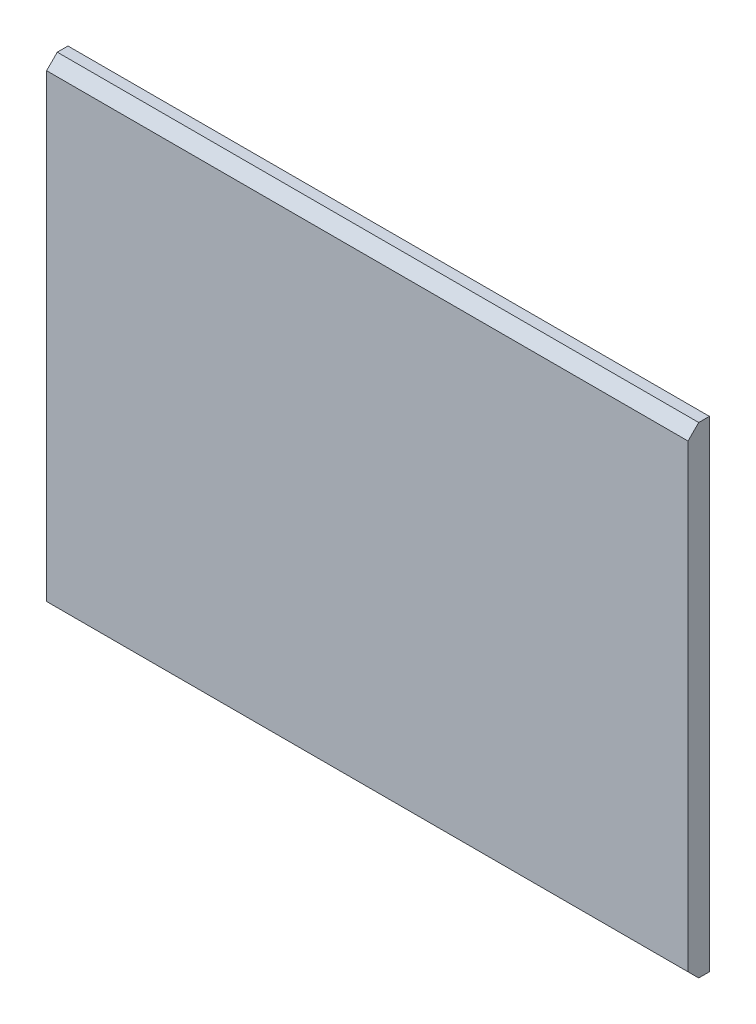
ISO-10303-21;
HEADER;
FILE_DESCRIPTION(('STEP AP214'),'2;1');
FILE_NAME('part.step','',(''),(''),'','','');
FILE_SCHEMA(('AUTOMOTIVE_DESIGN { 1 0 10303 214 1 1 1 1 }'));
ENDSEC;
DATA;
#1=APPLICATION_CONTEXT('core data for automotive mechanical design processes');
#2=APPLICATION_PROTOCOL_DEFINITION('international standard','automotive_design',2000,#1);
#3=PRODUCT_CONTEXT('',#1,'mechanical');
#4=PRODUCT('Part','Part','',(#3));
#5=PRODUCT_RELATED_PRODUCT_CATEGORY('part','',(#4));
#6=PRODUCT_DEFINITION_FORMATION('','',#4);
#7=PRODUCT_DEFINITION_CONTEXT('part definition',#1,'design');
#8=PRODUCT_DEFINITION('design','',#6,#7);
#9=PRODUCT_DEFINITION_SHAPE('','',#8);
#10=(LENGTH_UNIT() NAMED_UNIT(*) SI_UNIT(.MILLI.,.METRE.));
#11=(NAMED_UNIT(*) PLANE_ANGLE_UNIT() SI_UNIT($,.RADIAN.));
#12=(NAMED_UNIT(*) SI_UNIT($,.STERADIAN.) SOLID_ANGLE_UNIT());
#13=UNCERTAINTY_MEASURE_WITH_UNIT(LENGTH_MEASURE(1.E-05),#10,'distance_accuracy_value','');
#14=(GEOMETRIC_REPRESENTATION_CONTEXT(3) GLOBAL_UNCERTAINTY_ASSIGNED_CONTEXT((#13)) GLOBAL_UNIT_ASSIGNED_CONTEXT((#10,
#11,#12)) REPRESENTATION_CONTEXT('',''));
#15=CARTESIAN_POINT('',(0.,0.,0.));
#16=DIRECTION('',(0.,0.,1.));
#17=DIRECTION('',(1.,0.,0.));
#18=AXIS2_PLACEMENT_3D('',#15,#16,#17);
#19=CARTESIAN_POINT('',(150.,112.5,10.));
#20=DIRECTION('',(-1.,0.,0.));
#21=DIRECTION('',(0.,-1.,0.));
#22=AXIS2_PLACEMENT_3D('',#19,#20,#21);
#23=PLANE('',#22);
#24=DIRECTION('',(0.,1.,0.));
#25=VECTOR('',#24,1.);
#26=CARTESIAN_POINT('',(150.,112.5,10.));
#27=LINE('',#26,#25);
#28=CARTESIAN_POINT('',(150.,-107.5,10.));
#29=VERTEX_POINT('',#28);
#30=CARTESIAN_POINT('',(150.,107.5,10.));
#31=VERTEX_POINT('',#30);
#32=EDGE_CURVE('E119',#29,#31,#27,.T.);
#33=ORIENTED_EDGE('',*,*,#32,.F.);
#34=DIRECTION('',(0.,-0.707106781186544,-0.707106781186551));
#35=VECTOR('',#34,1.);
#36=CARTESIAN_POINT('',(150.,-107.5,10.));
#37=LINE('',#36,#35);
#38=CARTESIAN_POINT('',(150.,-112.5,4.99999999999994));
#39=VERTEX_POINT('',#38);
#40=EDGE_CURVE('E131',#29,#39,#37,.T.);
#41=ORIENTED_EDGE('',*,*,#40,.T.);
#42=DIRECTION('',(0.,0.,-1.));
#43=VECTOR('',#42,1.);
#44=CARTESIAN_POINT('',(150.,-112.5,10.));
#45=LINE('',#44,#43);
#46=CARTESIAN_POINT('',(150.,-112.5,0.));
#47=VERTEX_POINT('',#46);
#48=EDGE_CURVE('E109',#39,#47,#45,.T.);
#49=ORIENTED_EDGE('',*,*,#48,.T.);
#50=DIRECTION('',(0.,1.,0.));
#51=VECTOR('',#50,1.);
#52=CARTESIAN_POINT('',(150.,112.5,0.));
#53=LINE('',#52,#51);
#54=CARTESIAN_POINT('',(150.,112.5,0.));
#55=VERTEX_POINT('',#54);
#56=EDGE_CURVE('E104',#47,#55,#53,.T.);
#57=ORIENTED_EDGE('',*,*,#56,.T.);
#58=DIRECTION('',(0.,0.,-1.));
#59=VECTOR('',#58,1.);
#60=CARTESIAN_POINT('',(150.,112.5,10.));
#61=LINE('',#60,#59);
#62=CARTESIAN_POINT('',(150.,112.5,5.));
#63=VERTEX_POINT('',#62);
#64=EDGE_CURVE('E88',#63,#55,#61,.T.);
#65=ORIENTED_EDGE('',*,*,#64,.F.);
#66=DIRECTION('',(0.,-0.707106781186544,0.707106781186551));
#67=VECTOR('',#66,1.);
#68=CARTESIAN_POINT('',(150.,107.5,9.99999999999998));
#69=LINE('',#68,#67);
#70=EDGE_CURVE('E129',#63,#31,#69,.T.);
#71=ORIENTED_EDGE('',*,*,#70,.T.);
#72=EDGE_LOOP('',(#33,#41,#49,#57,#65,#71));
#73=FACE_BOUND('',#72,.T.);
#74=ADVANCED_FACE('F35',(#73),#23,.F.);
#75=CARTESIAN_POINT('',(-150.,112.5,10.));
#76=DIRECTION('',(0.,-1.,0.));
#77=DIRECTION('',(0.,0.,-1.));
#78=AXIS2_PLACEMENT_3D('',#75,#76,#77);
#79=PLANE('',#78);
#80=DIRECTION('',(0.,0.,-1.));
#81=VECTOR('',#80,1.);
#82=CARTESIAN_POINT('',(-150.,112.5,10.));
#83=LINE('',#82,#81);
#84=CARTESIAN_POINT('',(-150.,112.5,5.));
#85=VERTEX_POINT('',#84);
#86=CARTESIAN_POINT('',(-150.,112.5,0.));
#87=VERTEX_POINT('',#86);
#88=EDGE_CURVE('E98',#85,#87,#83,.T.);
#89=ORIENTED_EDGE('',*,*,#88,.F.);
#90=DIRECTION('',(1.,0.,0.));
#91=VECTOR('',#90,1.);
#92=CARTESIAN_POINT('',(150.,112.5,5.));
#93=LINE('',#92,#91);
#94=EDGE_CURVE('E11',#85,#63,#93,.T.);
#95=ORIENTED_EDGE('',*,*,#94,.T.);
#96=ORIENTED_EDGE('',*,*,#64,.T.);
#97=DIRECTION('',(-1.,0.,0.));
#98=VECTOR('',#97,1.);
#99=CARTESIAN_POINT('',(-150.,112.5,0.));
#100=LINE('',#99,#98);
#101=EDGE_CURVE('E91',#55,#87,#100,.T.);
#102=ORIENTED_EDGE('',*,*,#101,.T.);
#103=EDGE_LOOP('',(#89,#95,#96,#102));
#104=FACE_BOUND('',#103,.T.);
#105=ADVANCED_FACE('F90',(#104),#79,.F.);
#106=CARTESIAN_POINT('',(-150.,112.5,10.));
#107=DIRECTION('',(1.,0.,0.));
#108=DIRECTION('',(0.,1.,0.));
#109=AXIS2_PLACEMENT_3D('',#106,#107,#108);
#110=PLANE('',#109);
#111=DIRECTION('',(0.,0.,-1.));
#112=VECTOR('',#111,1.);
#113=CARTESIAN_POINT('',(-150.,-112.5,10.));
#114=LINE('',#113,#112);
#115=CARTESIAN_POINT('',(-150.,-112.5,4.99999999999994));
#116=VERTEX_POINT('',#115);
#117=CARTESIAN_POINT('',(-150.,-112.5,0.));
#118=VERTEX_POINT('',#117);
#119=EDGE_CURVE('E121',#116,#118,#114,.T.);
#120=ORIENTED_EDGE('',*,*,#119,.F.);
#121=DIRECTION('',(0.,0.707106781186544,0.707106781186551));
#122=VECTOR('',#121,1.);
#123=CARTESIAN_POINT('',(-150.,-107.5,9.99999999999998));
#124=LINE('',#123,#122);
#125=CARTESIAN_POINT('',(-150.,-107.5,10.));
#126=VERTEX_POINT('',#125);
#127=EDGE_CURVE('E43',#116,#126,#124,.T.);
#128=ORIENTED_EDGE('',*,*,#127,.T.);
#129=DIRECTION('',(0.,-1.,0.));
#130=VECTOR('',#129,1.);
#131=CARTESIAN_POINT('',(-150.,112.5,10.));
#132=LINE('',#131,#130);
#133=CARTESIAN_POINT('',(-150.,107.5,10.));
#134=VERTEX_POINT('',#133);
#135=EDGE_CURVE('E113',#134,#126,#132,.T.);
#136=ORIENTED_EDGE('',*,*,#135,.F.);
#137=DIRECTION('',(0.,0.707106781186544,-0.707106781186551));
#138=VECTOR('',#137,1.);
#139=CARTESIAN_POINT('',(-150.,107.5,10.));
#140=LINE('',#139,#138);
#141=EDGE_CURVE('E50',#134,#85,#140,.T.);
#142=ORIENTED_EDGE('',*,*,#141,.T.);
#143=ORIENTED_EDGE('',*,*,#88,.T.);
#144=DIRECTION('',(0.,-1.,0.));
#145=VECTOR('',#144,1.);
#146=CARTESIAN_POINT('',(-150.,112.5,0.));
#147=LINE('',#146,#145);
#148=EDGE_CURVE('E106',#87,#118,#147,.T.);
#149=ORIENTED_EDGE('',*,*,#148,.T.);
#150=EDGE_LOOP('',(#120,#128,#136,#142,#143,#149));
#151=FACE_BOUND('',#150,.T.);
#152=ADVANCED_FACE('F136',(#151),#110,.F.);
#153=CARTESIAN_POINT('',(-150.,-112.5,10.));
#154=DIRECTION('',(0.,1.,0.));
#155=DIRECTION('',(0.,0.,1.));
#156=AXIS2_PLACEMENT_3D('',#153,#154,#155);
#157=PLANE('',#156);
#158=ORIENTED_EDGE('',*,*,#48,.F.);
#159=DIRECTION('',(-1.,0.,0.));
#160=VECTOR('',#159,1.);
#161=CARTESIAN_POINT('',(-150.,-112.5,4.99999999999994));
#162=LINE('',#161,#160);
#163=EDGE_CURVE('E58',#39,#116,#162,.T.);
#164=ORIENTED_EDGE('',*,*,#163,.T.);
#165=ORIENTED_EDGE('',*,*,#119,.T.);
#166=DIRECTION('',(1.,0.,0.));
#167=VECTOR('',#166,1.);
#168=CARTESIAN_POINT('',(-150.,-112.5,0.));
#169=LINE('',#168,#167);
#170=EDGE_CURVE('E117',#118,#47,#169,.T.);
#171=ORIENTED_EDGE('',*,*,#170,.T.);
#172=EDGE_LOOP('',(#158,#164,#165,#171));
#173=FACE_BOUND('',#172,.T.);
#174=ADVANCED_FACE('F144',(#173),#157,.F.);
#175=CARTESIAN_POINT('',(0.,0.,10.));
#176=DIRECTION('',(0.,0.,1.));
#177=DIRECTION('',(1.,0.,0.));
#178=AXIS2_PLACEMENT_3D('',#175,#176,#177);
#179=PLANE('',#178);
#180=ORIENTED_EDGE('',*,*,#135,.T.);
#181=DIRECTION('',(1.,0.,0.));
#182=VECTOR('',#181,1.);
#183=CARTESIAN_POINT('',(150.,-107.5,10.));
#184=LINE('',#183,#182);
#185=EDGE_CURVE('E126',#126,#29,#184,.T.);
#186=ORIENTED_EDGE('',*,*,#185,.T.);
#187=ORIENTED_EDGE('',*,*,#32,.T.);
#188=DIRECTION('',(-1.,0.,0.));
#189=VECTOR('',#188,1.);
#190=CARTESIAN_POINT('',(-150.,107.5,10.));
#191=LINE('',#190,#189);
#192=EDGE_CURVE('E97',#31,#134,#191,.T.);
#193=ORIENTED_EDGE('',*,*,#192,.T.);
#194=EDGE_LOOP('',(#180,#186,#187,#193));
#195=FACE_BOUND('',#194,.T.);
#196=ADVANCED_FACE('F140',(#195),#179,.T.);
#197=CARTESIAN_POINT('',(0.,0.,0.));
#198=DIRECTION('',(0.,0.,1.));
#199=DIRECTION('',(1.,0.,0.));
#200=AXIS2_PLACEMENT_3D('',#197,#198,#199);
#201=PLANE('',#200);
#202=ORIENTED_EDGE('',*,*,#56,.F.);
#203=ORIENTED_EDGE('',*,*,#170,.F.);
#204=ORIENTED_EDGE('',*,*,#148,.F.);
#205=ORIENTED_EDGE('',*,*,#101,.F.);
#206=EDGE_LOOP('',(#202,#203,#204,#205));
#207=FACE_BOUND('',#206,.T.);
#208=ADVANCED_FACE('F102',(#207),#201,.F.);
#209=CARTESIAN_POINT('',(0.,-107.5,10.));
#210=DIRECTION('',(0.,-0.707106781186551,0.707106781186543));
#211=DIRECTION('',(-1.,0.,0.));
#212=AXIS2_PLACEMENT_3D('',#209,#210,#211);
#213=PLANE('',#212);
#214=ORIENTED_EDGE('',*,*,#127,.F.);
#215=ORIENTED_EDGE('',*,*,#163,.F.);
#216=ORIENTED_EDGE('',*,*,#40,.F.);
#217=ORIENTED_EDGE('',*,*,#185,.F.);
#218=EDGE_LOOP('',(#214,#215,#216,#217));
#219=FACE_BOUND('',#218,.T.);
#220=ADVANCED_FACE('F143',(#219),#213,.T.);
#221=CARTESIAN_POINT('',(0.,107.5,10.));
#222=DIRECTION('',(0.,0.707106781186551,0.707106781186544));
#223=DIRECTION('',(1.,0.,0.));
#224=AXIS2_PLACEMENT_3D('',#221,#222,#223);
#225=PLANE('',#224);
#226=ORIENTED_EDGE('',*,*,#70,.F.);
#227=ORIENTED_EDGE('',*,*,#94,.F.);
#228=ORIENTED_EDGE('',*,*,#141,.F.);
#229=ORIENTED_EDGE('',*,*,#192,.F.);
#230=EDGE_LOOP('',(#226,#227,#228,#229));
#231=FACE_BOUND('',#230,.T.);
#232=ADVANCED_FACE('F37',(#231),#225,.T.);
#233=CLOSED_SHELL('',(#74,#105,#152,#174,#196,#208,#220,#232));
#234=MANIFOLD_SOLID_BREP('B2',#233);
#235=ADVANCED_BREP_SHAPE_REPRESENTATION('',(#18,#234),#14);
#236=SHAPE_DEFINITION_REPRESENTATION(#9,#235);
ENDSEC;
END-ISO-10303-21;
